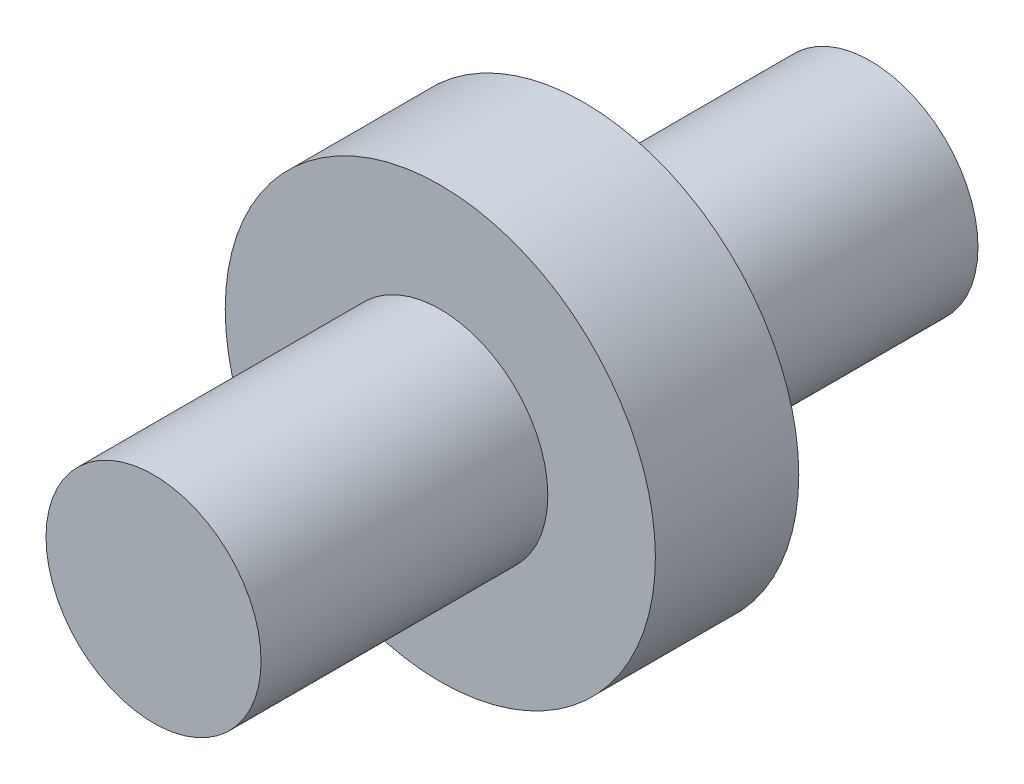
ISO-10303-21;
HEADER;
FILE_DESCRIPTION(('STEP AP214'),'2;1');
FILE_NAME('part.step','',(''),(''),'','','');
FILE_SCHEMA(('AUTOMOTIVE_DESIGN { 1 0 10303 214 1 1 1 1 }'));
ENDSEC;
DATA;
#1=APPLICATION_CONTEXT('core data for automotive mechanical design processes');
#2=APPLICATION_PROTOCOL_DEFINITION('international standard','automotive_design',2000,#1);
#3=PRODUCT_CONTEXT('',#1,'mechanical');
#4=PRODUCT('Part','Part','',(#3));
#5=PRODUCT_RELATED_PRODUCT_CATEGORY('part','',(#4));
#6=PRODUCT_DEFINITION_FORMATION('','',#4);
#7=PRODUCT_DEFINITION_CONTEXT('part definition',#1,'design');
#8=PRODUCT_DEFINITION('design','',#6,#7);
#9=PRODUCT_DEFINITION_SHAPE('','',#8);
#10=(LENGTH_UNIT() NAMED_UNIT(*) SI_UNIT(.MILLI.,.METRE.));
#11=(NAMED_UNIT(*) PLANE_ANGLE_UNIT() SI_UNIT($,.RADIAN.));
#12=(NAMED_UNIT(*) SI_UNIT($,.STERADIAN.) SOLID_ANGLE_UNIT());
#13=UNCERTAINTY_MEASURE_WITH_UNIT(LENGTH_MEASURE(1.E-05),#10,'distance_accuracy_value','');
#14=(GEOMETRIC_REPRESENTATION_CONTEXT(3) GLOBAL_UNCERTAINTY_ASSIGNED_CONTEXT((#13)) GLOBAL_UNIT_ASSIGNED_CONTEXT((#10,
#11,#12)) REPRESENTATION_CONTEXT('',''));
#15=CARTESIAN_POINT('',(0.,0.,0.));
#16=DIRECTION('',(0.,0.,1.));
#17=DIRECTION('',(1.,0.,0.));
#18=AXIS2_PLACEMENT_3D('',#15,#16,#17);
#19=CARTESIAN_POINT('',(0.,0.,25.4));
#20=DIRECTION('',(0.,0.,-1.));
#21=DIRECTION('',(-1.,0.,0.));
#22=AXIS2_PLACEMENT_3D('',#19,#20,#21);
#23=CYLINDRICAL_SURFACE('',#22,9.525);
#24=CARTESIAN_POINT('',(0.,0.,25.4));
#25=DIRECTION('',(0.,0.,1.));
#26=DIRECTION('',(1.,0.,0.));
#27=AXIS2_PLACEMENT_3D('',#24,#25,#26);
#28=CIRCLE('',#27,9.525);
#29=CARTESIAN_POINT('',(9.525,0.,25.4));
#30=VERTEX_POINT('',#29);
#31=EDGE_CURVE('E38',#30,#30,#28,.T.);
#32=ORIENTED_EDGE('',*,*,#31,.F.);
#33=EDGE_LOOP('',(#32));
#34=FACE_BOUND('',#33,.T.);
#35=CARTESIAN_POINT('',(0.,0.,0.));
#36=DIRECTION('',(0.,0.,1.));
#37=DIRECTION('',(1.,0.,0.));
#38=AXIS2_PLACEMENT_3D('',#35,#36,#37);
#39=CIRCLE('',#38,9.525);
#40=CARTESIAN_POINT('',(9.525,0.,0.));
#41=VERTEX_POINT('',#40);
#42=EDGE_CURVE('E34',#41,#41,#39,.T.);
#43=ORIENTED_EDGE('',*,*,#42,.T.);
#44=EDGE_LOOP('',(#43));
#45=FACE_BOUND('',#44,.T.);
#46=ADVANCED_FACE('F31',(#34,#45),#23,.T.);
#47=CARTESIAN_POINT('',(0.,0.,0.));
#48=DIRECTION('',(0.,0.,1.));
#49=DIRECTION('',(1.,0.,0.));
#50=AXIS2_PLACEMENT_3D('',#47,#48,#49);
#51=PLANE('',#50);
#52=ORIENTED_EDGE('',*,*,#42,.F.);
#53=EDGE_LOOP('',(#52));
#54=FACE_BOUND('',#53,.T.);
#55=ADVANCED_FACE('F72',(#54),#51,.F.);
#56=CARTESIAN_POINT('',(0.,0.,38.1));
#57=DIRECTION('',(0.,0.,-1.));
#58=DIRECTION('',(-1.,0.,0.));
#59=AXIS2_PLACEMENT_3D('',#56,#57,#58);
#60=CYLINDRICAL_SURFACE('',#59,19.05);
#61=CARTESIAN_POINT('',(0.,0.,38.1));
#62=DIRECTION('',(0.,0.,1.));
#63=DIRECTION('',(1.,0.,0.));
#64=AXIS2_PLACEMENT_3D('',#61,#62,#63);
#65=CIRCLE('',#64,19.05);
#66=CARTESIAN_POINT('',(19.05,0.,38.1));
#67=VERTEX_POINT('',#66);
#68=EDGE_CURVE('E46',#67,#67,#65,.T.);
#69=ORIENTED_EDGE('',*,*,#68,.F.);
#70=EDGE_LOOP('',(#69));
#71=FACE_BOUND('',#70,.T.);
#72=CARTESIAN_POINT('',(0.,0.,25.4));
#73=DIRECTION('',(0.,0.,1.));
#74=DIRECTION('',(1.,0.,0.));
#75=AXIS2_PLACEMENT_3D('',#72,#73,#74);
#76=CIRCLE('',#75,19.05);
#77=CARTESIAN_POINT('',(19.05,0.,25.4));
#78=VERTEX_POINT('',#77);
#79=EDGE_CURVE('E49',#78,#78,#76,.T.);
#80=ORIENTED_EDGE('',*,*,#79,.T.);
#81=EDGE_LOOP('',(#80));
#82=FACE_BOUND('',#81,.T.);
#83=ADVANCED_FACE('F77',(#71,#82),#60,.T.);
#84=CARTESIAN_POINT('',(0.,0.,38.1));
#85=DIRECTION('',(0.,0.,1.));
#86=DIRECTION('',(1.,0.,0.));
#87=AXIS2_PLACEMENT_3D('',#84,#85,#86);
#88=PLANE('',#87);
#89=CARTESIAN_POINT('',(0.,0.,38.1));
#90=DIRECTION('',(0.,0.,1.));
#91=DIRECTION('',(1.,0.,0.));
#92=AXIS2_PLACEMENT_3D('',#89,#90,#91);
#93=CIRCLE('',#92,9.525);
#94=CARTESIAN_POINT('',(9.525,0.,38.1));
#95=VERTEX_POINT('',#94);
#96=EDGE_CURVE('E10',#95,#95,#93,.T.);
#97=ORIENTED_EDGE('',*,*,#96,.F.);
#98=EDGE_LOOP('',(#97));
#99=FACE_BOUND('',#98,.T.);
#100=ORIENTED_EDGE('',*,*,#68,.T.);
#101=EDGE_LOOP('',(#100));
#102=FACE_BOUND('',#101,.T.);
#103=ADVANCED_FACE('F67',(#99,#102),#88,.T.);
#104=CARTESIAN_POINT('',(0.,0.,25.4));
#105=DIRECTION('',(0.,0.,1.));
#106=DIRECTION('',(1.,0.,0.));
#107=AXIS2_PLACEMENT_3D('',#104,#105,#106);
#108=PLANE('',#107);
#109=ORIENTED_EDGE('',*,*,#31,.T.);
#110=EDGE_LOOP('',(#109));
#111=FACE_BOUND('',#110,.T.);
#112=ORIENTED_EDGE('',*,*,#79,.F.);
#113=EDGE_LOOP('',(#112));
#114=FACE_BOUND('',#113,.T.);
#115=ADVANCED_FACE('F60',(#111,#114),#108,.F.);
#116=CARTESIAN_POINT('',(0.,0.,63.5));
#117=DIRECTION('',(0.,0.,-1.));
#118=DIRECTION('',(-1.,0.,0.));
#119=AXIS2_PLACEMENT_3D('',#116,#117,#118);
#120=CYLINDRICAL_SURFACE('',#119,9.525);
#121=CARTESIAN_POINT('',(0.,0.,63.5));
#122=DIRECTION('',(0.,0.,1.));
#123=DIRECTION('',(1.,0.,0.));
#124=AXIS2_PLACEMENT_3D('',#121,#122,#123);
#125=CIRCLE('',#124,9.525);
#126=CARTESIAN_POINT('',(9.525,0.,63.5));
#127=VERTEX_POINT('',#126);
#128=EDGE_CURVE('E45',#127,#127,#125,.T.);
#129=ORIENTED_EDGE('',*,*,#128,.F.);
#130=EDGE_LOOP('',(#129));
#131=FACE_BOUND('',#130,.T.);
#132=ORIENTED_EDGE('',*,*,#96,.T.);
#133=EDGE_LOOP('',(#132));
#134=FACE_BOUND('',#133,.T.);
#135=ADVANCED_FACE('F58',(#131,#134),#120,.T.);
#136=CARTESIAN_POINT('',(0.,0.,63.5));
#137=DIRECTION('',(0.,0.,1.));
#138=DIRECTION('',(1.,0.,0.));
#139=AXIS2_PLACEMENT_3D('',#136,#137,#138);
#140=PLANE('',#139);
#141=ORIENTED_EDGE('',*,*,#128,.T.);
#142=EDGE_LOOP('',(#141));
#143=FACE_BOUND('',#142,.T.);
#144=ADVANCED_FACE('F56',(#143),#140,.T.);
#145=CLOSED_SHELL('',(#46,#55,#83,#103,#115,#135,#144));
#146=MANIFOLD_SOLID_BREP('B2',#145);
#147=ADVANCED_BREP_SHAPE_REPRESENTATION('',(#18,#146),#14);
#148=SHAPE_DEFINITION_REPRESENTATION(#9,#147);
ENDSEC;
END-ISO-10303-21;
